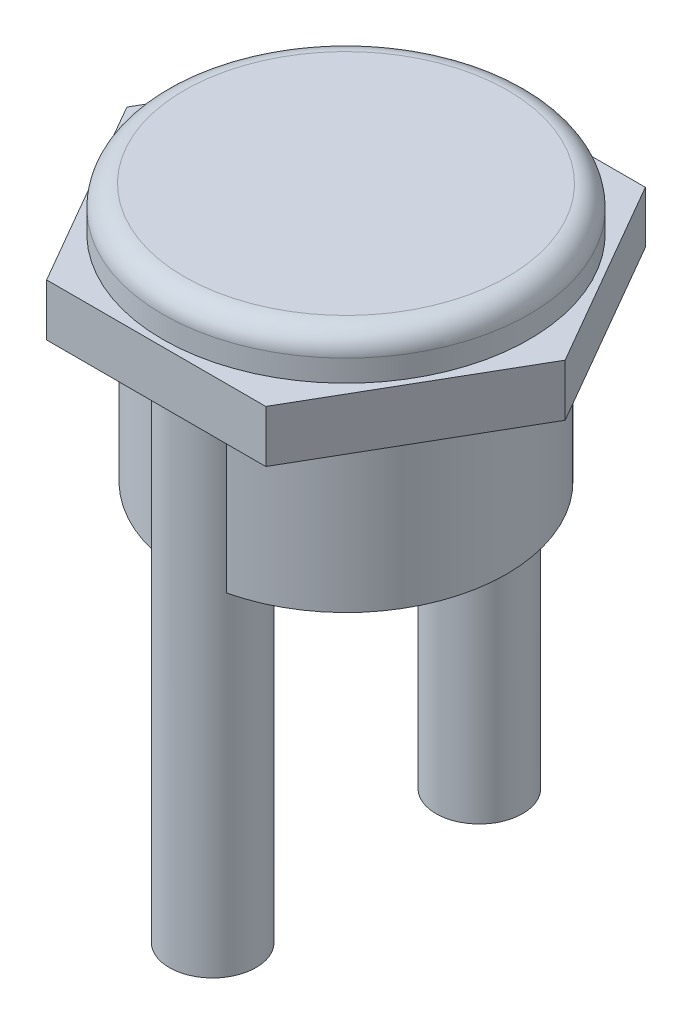
ISO-10303-21;
HEADER;
FILE_DESCRIPTION(('STEP AP214'),'2;1');
FILE_NAME('part.step','',(''),(''),'','','');
FILE_SCHEMA(('AUTOMOTIVE_DESIGN { 1 0 10303 214 1 1 1 1 }'));
ENDSEC;
DATA;
#1=APPLICATION_CONTEXT('core data for automotive mechanical design processes');
#2=APPLICATION_PROTOCOL_DEFINITION('international standard','automotive_design',2000,#1);
#3=PRODUCT_CONTEXT('',#1,'mechanical');
#4=PRODUCT('Part','Part','',(#3));
#5=PRODUCT_RELATED_PRODUCT_CATEGORY('part','',(#4));
#6=PRODUCT_DEFINITION_FORMATION('','',#4);
#7=PRODUCT_DEFINITION_CONTEXT('part definition',#1,'design');
#8=PRODUCT_DEFINITION('design','',#6,#7);
#9=PRODUCT_DEFINITION_SHAPE('','',#8);
#10=(LENGTH_UNIT() NAMED_UNIT(*) SI_UNIT(.MILLI.,.METRE.));
#11=(NAMED_UNIT(*) PLANE_ANGLE_UNIT() SI_UNIT($,.RADIAN.));
#12=(NAMED_UNIT(*) SI_UNIT($,.STERADIAN.) SOLID_ANGLE_UNIT());
#13=UNCERTAINTY_MEASURE_WITH_UNIT(LENGTH_MEASURE(1.E-05),#10,'distance_accuracy_value','');
#14=(GEOMETRIC_REPRESENTATION_CONTEXT(3) GLOBAL_UNCERTAINTY_ASSIGNED_CONTEXT((#13)) GLOBAL_UNIT_ASSIGNED_CONTEXT((#10,
#11,#12)) REPRESENTATION_CONTEXT('',''));
#15=CARTESIAN_POINT('',(0.,0.,0.));
#16=DIRECTION('',(0.,0.,1.));
#17=DIRECTION('',(1.,0.,0.));
#18=AXIS2_PLACEMENT_3D('',#15,#16,#17);
#19=CARTESIAN_POINT('',(0.,-12.573,0.));
#20=DIRECTION('',(0.,1.,0.));
#21=DIRECTION('',(0.,0.,1.));
#22=AXIS2_PLACEMENT_3D('',#19,#20,#21);
#23=CYLINDRICAL_SURFACE('',#22,9.398);
#24=DIRECTION('',(0.,1.,0.));
#25=VECTOR('',#24,1.);
#26=CARTESIAN_POINT('',(-2.15753712528231,-17.548,-9.14699062823553));
#27=LINE('',#26,#25);
#28=CARTESIAN_POINT('',(-2.15753712528231,-12.573,-9.14699062823553));
#29=VERTEX_POINT('',#28);
#30=CARTESIAN_POINT('',(-2.15753712528231,-3.048,-9.14699062823553));
#31=VERTEX_POINT('',#30);
#32=EDGE_CURVE('E116',#29,#31,#27,.T.);
#33=ORIENTED_EDGE('',*,*,#32,.F.);
#34=CARTESIAN_POINT('',(0.,-12.573,0.));
#35=DIRECTION('',(0.,-1.,0.));
#36=DIRECTION('',(0.,0.,-1.));
#37=AXIS2_PLACEMENT_3D('',#34,#35,#36);
#38=CIRCLE('',#37,9.398);
#39=CARTESIAN_POINT('',(-2.15753712528231,-12.573,9.14699062823553));
#40=VERTEX_POINT('',#39);
#41=EDGE_CURVE('E141',#40,#29,#38,.T.);
#42=ORIENTED_EDGE('',*,*,#41,.F.);
#43=DIRECTION('',(0.,1.,0.));
#44=VECTOR('',#43,1.);
#45=CARTESIAN_POINT('',(-2.15753712528231,-17.548,9.14699062823553));
#46=LINE('',#45,#44);
#47=CARTESIAN_POINT('',(-2.15753712528231,-3.048,9.14699062823553));
#48=VERTEX_POINT('',#47);
#49=EDGE_CURVE('E60',#48,#40,#46,.F.);
#50=ORIENTED_EDGE('',*,*,#49,.F.);
#51=CARTESIAN_POINT('',(0.,-3.048,0.));
#52=DIRECTION('',(0.,-1.,0.));
#53=DIRECTION('',(0.,0.,-1.));
#54=AXIS2_PLACEMENT_3D('',#51,#52,#53);
#55=CIRCLE('',#54,9.398);
#56=EDGE_CURVE('E135',#48,#31,#55,.T.);
#57=ORIENTED_EDGE('',*,*,#56,.T.);
#58=EDGE_LOOP('',(#33,#42,#50,#57));
#59=FACE_BOUND('',#58,.T.);
#60=ADVANCED_FACE('F37',(#59),#23,.T.);
#61=DIRECTION('',(0.,1.,0.));
#62=VECTOR('',#61,1.);
#63=CARTESIAN_POINT('',(2.15753712528231,-17.548,-9.14699062823553));
#64=LINE('',#63,#62);
#65=CARTESIAN_POINT('',(2.15753712528231,-3.048,-9.14699062823553));
#66=VERTEX_POINT('',#65);
#67=CARTESIAN_POINT('',(2.15753712528231,-12.573,-9.14699062823553));
#68=VERTEX_POINT('',#67);
#69=EDGE_CURVE('E52',#66,#68,#64,.F.);
#70=ORIENTED_EDGE('',*,*,#69,.F.);
#71=CARTESIAN_POINT('',(2.15753712528231,-3.048,9.14699062823553));
#72=VERTEX_POINT('',#71);
#73=EDGE_CURVE('E127',#66,#72,#55,.T.);
#74=ORIENTED_EDGE('',*,*,#73,.T.);
#75=DIRECTION('',(0.,1.,0.));
#76=VECTOR('',#75,1.);
#77=CARTESIAN_POINT('',(2.15753712528231,-17.548,9.14699062823553));
#78=LINE('',#77,#76);
#79=CARTESIAN_POINT('',(2.15753712528231,-12.573,9.14699062823553));
#80=VERTEX_POINT('',#79);
#81=EDGE_CURVE('E136',#80,#72,#78,.T.);
#82=ORIENTED_EDGE('',*,*,#81,.F.);
#83=EDGE_CURVE('E129',#68,#80,#38,.T.);
#84=ORIENTED_EDGE('',*,*,#83,.F.);
#85=EDGE_LOOP('',(#70,#74,#82,#84));
#86=FACE_BOUND('',#85,.T.);
#87=ADVANCED_FACE('F125',(#86),#23,.T.);
#88=CARTESIAN_POINT('',(0.,2.54,0.));
#89=DIRECTION('',(0.,-1.,0.));
#90=DIRECTION('',(0.,0.,-1.));
#91=AXIS2_PLACEMENT_3D('',#88,#89,#90);
#92=CYLINDRICAL_SURFACE('',#91,10.7315);
#93=CARTESIAN_POINT('',(0.,1.27,0.));
#94=DIRECTION('',(0.,1.,0.));
#95=DIRECTION('',(0.,0.,1.));
#96=AXIS2_PLACEMENT_3D('',#93,#94,#95);
#97=CIRCLE('',#96,10.7315);
#98=CARTESIAN_POINT('',(0.,1.27,10.7315));
#99=VERTEX_POINT('',#98);
#100=EDGE_CURVE('E12',#99,#99,#97,.F.);
#101=ORIENTED_EDGE('',*,*,#100,.T.);
#102=EDGE_LOOP('',(#101));
#103=FACE_BOUND('',#102,.T.);
#104=CARTESIAN_POINT('',(0.,0.,0.));
#105=DIRECTION('',(0.,-1.,0.));
#106=DIRECTION('',(0.,0.,-1.));
#107=AXIS2_PLACEMENT_3D('',#104,#105,#106);
#108=CIRCLE('',#107,10.7315);
#109=CARTESIAN_POINT('',(0.,0.,-10.7315));
#110=VERTEX_POINT('',#109);
#111=EDGE_CURVE('E186',#110,#110,#108,.T.);
#112=ORIENTED_EDGE('',*,*,#111,.F.);
#113=EDGE_LOOP('',(#112));
#114=FACE_BOUND('',#113,.T.);
#115=ADVANCED_FACE('F212',(#103,#114),#92,.T.);
#116=CARTESIAN_POINT('',(0.,2.54,0.));
#117=DIRECTION('',(0.,1.,0.));
#118=DIRECTION('',(0.,0.,1.));
#119=AXIS2_PLACEMENT_3D('',#116,#117,#118);
#120=PLANE('',#119);
#121=CARTESIAN_POINT('',(0.,2.54,0.));
#122=DIRECTION('',(0.,1.,0.));
#123=DIRECTION('',(0.,0.,1.));
#124=AXIS2_PLACEMENT_3D('',#121,#122,#123);
#125=CIRCLE('',#124,9.4615);
#126=CARTESIAN_POINT('',(0.,2.54,9.4615));
#127=VERTEX_POINT('',#126);
#128=EDGE_CURVE('E45',#127,#127,#125,.T.);
#129=ORIENTED_EDGE('',*,*,#128,.T.);
#130=EDGE_LOOP('',(#129));
#131=FACE_BOUND('',#130,.T.);
#132=ADVANCED_FACE('F195',(#131),#120,.T.);
#133=CARTESIAN_POINT('',(-6.41580486636972,-3.048,11.1125));
#134=DIRECTION('',(0.866025403784438,0.,-0.5));
#135=DIRECTION('',(-0.5,0.,-0.866025403784439));
#136=AXIS2_PLACEMENT_3D('',#133,#134,#135);
#137=PLANE('',#136);
#138=DIRECTION('',(-0.5,0.,-0.866025403784438));
#139=VECTOR('',#138,1.);
#140=CARTESIAN_POINT('',(-6.41580486636972,0.,11.1125));
#141=LINE('',#140,#139);
#142=CARTESIAN_POINT('',(-6.41580486636972,0.,11.1125));
#143=VERTEX_POINT('',#142);
#144=CARTESIAN_POINT('',(-12.8316097327394,0.,0.));
#145=VERTEX_POINT('',#144);
#146=EDGE_CURVE('E157',#143,#145,#141,.T.);
#147=ORIENTED_EDGE('',*,*,#146,.T.);
#148=DIRECTION('',(0.,1.,0.));
#149=VECTOR('',#148,1.);
#150=CARTESIAN_POINT('',(-12.8316097327394,-3.048,0.));
#151=LINE('',#150,#149);
#152=CARTESIAN_POINT('',(-12.8316097327394,-3.048,0.));
#153=VERTEX_POINT('',#152);
#154=EDGE_CURVE('E183',#153,#145,#151,.T.);
#155=ORIENTED_EDGE('',*,*,#154,.F.);
#156=DIRECTION('',(-0.5,0.,-0.866025403784438));
#157=VECTOR('',#156,1.);
#158=CARTESIAN_POINT('',(-6.41580486636972,-3.048,11.1125));
#159=LINE('',#158,#157);
#160=CARTESIAN_POINT('',(-6.41580486636972,-3.048,11.1125));
#161=VERTEX_POINT('',#160);
#162=EDGE_CURVE('E142',#161,#153,#159,.T.);
#163=ORIENTED_EDGE('',*,*,#162,.F.);
#164=DIRECTION('',(0.,1.,0.));
#165=VECTOR('',#164,1.);
#166=CARTESIAN_POINT('',(-6.41580486636972,-3.048,11.1125));
#167=LINE('',#166,#165);
#168=EDGE_CURVE('E156',#161,#143,#167,.T.);
#169=ORIENTED_EDGE('',*,*,#168,.T.);
#170=EDGE_LOOP('',(#147,#155,#163,#169));
#171=FACE_BOUND('',#170,.T.);
#172=ADVANCED_FACE('F242',(#171),#137,.F.);
#173=CARTESIAN_POINT('',(-12.8316097327394,-3.048,0.));
#174=DIRECTION('',(0.866025403784439,0.,0.5));
#175=DIRECTION('',(0.5,0.,-0.866025403784439));
#176=AXIS2_PLACEMENT_3D('',#173,#174,#175);
#177=PLANE('',#176);
#178=DIRECTION('',(0.5,0.,-0.866025403784439));
#179=VECTOR('',#178,1.);
#180=CARTESIAN_POINT('',(-12.8316097327394,0.,0.));
#181=LINE('',#180,#179);
#182=CARTESIAN_POINT('',(-6.41580486636972,0.,-11.1125));
#183=VERTEX_POINT('',#182);
#184=EDGE_CURVE('E160',#145,#183,#181,.T.);
#185=ORIENTED_EDGE('',*,*,#184,.T.);
#186=DIRECTION('',(0.,1.,0.));
#187=VECTOR('',#186,1.);
#188=CARTESIAN_POINT('',(-6.41580486636972,-3.048,-11.1125));
#189=LINE('',#188,#187);
#190=CARTESIAN_POINT('',(-6.41580486636972,-3.048,-11.1125));
#191=VERTEX_POINT('',#190);
#192=EDGE_CURVE('E180',#191,#183,#189,.T.);
#193=ORIENTED_EDGE('',*,*,#192,.F.);
#194=DIRECTION('',(0.5,0.,-0.866025403784439));
#195=VECTOR('',#194,1.);
#196=CARTESIAN_POINT('',(-12.8316097327394,-3.048,0.));
#197=LINE('',#196,#195);
#198=EDGE_CURVE('E145',#153,#191,#197,.T.);
#199=ORIENTED_EDGE('',*,*,#198,.F.);
#200=ORIENTED_EDGE('',*,*,#154,.T.);
#201=EDGE_LOOP('',(#185,#193,#199,#200));
#202=FACE_BOUND('',#201,.T.);
#203=ADVANCED_FACE('F238',(#202),#177,.F.);
#204=CARTESIAN_POINT('',(-6.41580486636972,-3.048,-11.1125));
#205=DIRECTION('',(0.,0.,1.));
#206=DIRECTION('',(1.,0.,0.));
#207=AXIS2_PLACEMENT_3D('',#204,#205,#206);
#208=PLANE('',#207);
#209=DIRECTION('',(1.,0.,0.));
#210=VECTOR('',#209,1.);
#211=CARTESIAN_POINT('',(-6.41580486636972,0.,-11.1125));
#212=LINE('',#211,#210);
#213=CARTESIAN_POINT('',(6.41580486636971,0.,-11.1125));
#214=VERTEX_POINT('',#213);
#215=EDGE_CURVE('E162',#183,#214,#212,.T.);
#216=ORIENTED_EDGE('',*,*,#215,.T.);
#217=DIRECTION('',(0.,1.,0.));
#218=VECTOR('',#217,1.);
#219=CARTESIAN_POINT('',(6.41580486636971,-3.048,-11.1125));
#220=LINE('',#219,#218);
#221=CARTESIAN_POINT('',(6.41580486636971,-3.048,-11.1125));
#222=VERTEX_POINT('',#221);
#223=EDGE_CURVE('E177',#222,#214,#220,.T.);
#224=ORIENTED_EDGE('',*,*,#223,.F.);
#225=DIRECTION('',(1.,0.,0.));
#226=VECTOR('',#225,1.);
#227=CARTESIAN_POINT('',(-6.41580486636972,-3.048,-11.1125));
#228=LINE('',#227,#226);
#229=EDGE_CURVE('E148',#191,#222,#228,.T.);
#230=ORIENTED_EDGE('',*,*,#229,.F.);
#231=ORIENTED_EDGE('',*,*,#192,.T.);
#232=EDGE_LOOP('',(#216,#224,#230,#231));
#233=FACE_BOUND('',#232,.T.);
#234=ADVANCED_FACE('F234',(#233),#208,.F.);
#235=CARTESIAN_POINT('',(6.41580486636971,-3.048,-11.1125));
#236=DIRECTION('',(-0.866025403784439,0.,0.5));
#237=DIRECTION('',(0.5,0.,0.866025403784439));
#238=AXIS2_PLACEMENT_3D('',#235,#236,#237);
#239=PLANE('',#238);
#240=DIRECTION('',(0.5,0.,0.866025403784439));
#241=VECTOR('',#240,1.);
#242=CARTESIAN_POINT('',(6.41580486636971,0.,-11.1125));
#243=LINE('',#242,#241);
#244=CARTESIAN_POINT('',(12.8316097327394,0.,0.));
#245=VERTEX_POINT('',#244);
#246=EDGE_CURVE('E164',#214,#245,#243,.T.);
#247=ORIENTED_EDGE('',*,*,#246,.T.);
#248=DIRECTION('',(0.,1.,0.));
#249=VECTOR('',#248,1.);
#250=CARTESIAN_POINT('',(12.8316097327394,-3.048,0.));
#251=LINE('',#250,#249);
#252=CARTESIAN_POINT('',(12.8316097327394,-3.048,0.));
#253=VERTEX_POINT('',#252);
#254=EDGE_CURVE('E174',#253,#245,#251,.T.);
#255=ORIENTED_EDGE('',*,*,#254,.F.);
#256=DIRECTION('',(0.5,0.,0.866025403784439));
#257=VECTOR('',#256,1.);
#258=CARTESIAN_POINT('',(6.41580486636971,-3.048,-11.1125));
#259=LINE('',#258,#257);
#260=EDGE_CURVE('E150',#222,#253,#259,.T.);
#261=ORIENTED_EDGE('',*,*,#260,.F.);
#262=ORIENTED_EDGE('',*,*,#223,.T.);
#263=EDGE_LOOP('',(#247,#255,#261,#262));
#264=FACE_BOUND('',#263,.T.);
#265=ADVANCED_FACE('F230',(#264),#239,.F.);
#266=CARTESIAN_POINT('',(12.8316097327394,-3.048,0.));
#267=DIRECTION('',(-0.866025403784439,0.,-0.5));
#268=DIRECTION('',(-0.5,0.,0.866025403784439));
#269=AXIS2_PLACEMENT_3D('',#266,#267,#268);
#270=PLANE('',#269);
#271=DIRECTION('',(-0.5,0.,0.866025403784439));
#272=VECTOR('',#271,1.);
#273=CARTESIAN_POINT('',(12.8316097327394,0.,0.));
#274=LINE('',#273,#272);
#275=CARTESIAN_POINT('',(6.41580486636972,0.,11.1125));
#276=VERTEX_POINT('',#275);
#277=EDGE_CURVE('E166',#245,#276,#274,.T.);
#278=ORIENTED_EDGE('',*,*,#277,.T.);
#279=DIRECTION('',(0.,1.,0.));
#280=VECTOR('',#279,1.);
#281=CARTESIAN_POINT('',(6.41580486636972,-3.048,11.1125));
#282=LINE('',#281,#280);
#283=CARTESIAN_POINT('',(6.41580486636972,-3.048,11.1125));
#284=VERTEX_POINT('',#283);
#285=EDGE_CURVE('E171',#284,#276,#282,.T.);
#286=ORIENTED_EDGE('',*,*,#285,.F.);
#287=DIRECTION('',(-0.5,0.,0.866025403784439));
#288=VECTOR('',#287,1.);
#289=CARTESIAN_POINT('',(12.8316097327394,-3.048,0.));
#290=LINE('',#289,#288);
#291=EDGE_CURVE('E152',#253,#284,#290,.T.);
#292=ORIENTED_EDGE('',*,*,#291,.F.);
#293=ORIENTED_EDGE('',*,*,#254,.T.);
#294=EDGE_LOOP('',(#278,#286,#292,#293));
#295=FACE_BOUND('',#294,.T.);
#296=ADVANCED_FACE('F226',(#295),#270,.F.);
#297=CARTESIAN_POINT('',(6.41580486636972,-3.048,11.1125));
#298=DIRECTION('',(0.,0.,-1.));
#299=DIRECTION('',(-1.,0.,0.));
#300=AXIS2_PLACEMENT_3D('',#297,#298,#299);
#301=PLANE('',#300);
#302=DIRECTION('',(-1.,0.,0.));
#303=VECTOR('',#302,1.);
#304=CARTESIAN_POINT('',(6.41580486636972,0.,11.1125));
#305=LINE('',#304,#303);
#306=EDGE_CURVE('E146',#276,#143,#305,.T.);
#307=ORIENTED_EDGE('',*,*,#306,.T.);
#308=ORIENTED_EDGE('',*,*,#168,.F.);
#309=DIRECTION('',(-1.,0.,0.));
#310=VECTOR('',#309,1.);
#311=CARTESIAN_POINT('',(6.41580486636972,-3.048,11.1125));
#312=LINE('',#311,#310);
#313=EDGE_CURVE('E154',#284,#161,#312,.T.);
#314=ORIENTED_EDGE('',*,*,#313,.F.);
#315=ORIENTED_EDGE('',*,*,#285,.T.);
#316=EDGE_LOOP('',(#307,#308,#314,#315));
#317=FACE_BOUND('',#316,.T.);
#318=ADVANCED_FACE('F220',(#317),#301,.F.);
#319=CARTESIAN_POINT('',(0.,-3.048,0.));
#320=DIRECTION('',(0.,-1.,0.));
#321=DIRECTION('',(0.,0.,-1.));
#322=AXIS2_PLACEMENT_3D('',#319,#320,#321);
#323=PLANE('',#322);
#324=ORIENTED_EDGE('',*,*,#73,.F.);
#325=CARTESIAN_POINT('',(0.,-3.048,-7.80660502960036));
#326=DIRECTION('',(0.,-1.,0.));
#327=DIRECTION('',(0.,0.,-1.));
#328=AXIS2_PLACEMENT_3D('',#325,#326,#327);
#329=CIRCLE('',#328,2.54);
#330=EDGE_CURVE('E113',#31,#66,#329,.T.);
#331=ORIENTED_EDGE('',*,*,#330,.F.);
#332=ORIENTED_EDGE('',*,*,#56,.F.);
#333=CARTESIAN_POINT('',(0.,-3.048,7.80660502960036));
#334=DIRECTION('',(0.,-1.,0.));
#335=DIRECTION('',(0.,0.,-1.));
#336=AXIS2_PLACEMENT_3D('',#333,#334,#335);
#337=CIRCLE('',#336,2.54);
#338=EDGE_CURVE('E134',#72,#48,#337,.T.);
#339=ORIENTED_EDGE('',*,*,#338,.F.);
#340=EDGE_LOOP('',(#324,#331,#332,#339));
#341=FACE_BOUND('',#340,.T.);
#342=ORIENTED_EDGE('',*,*,#162,.T.);
#343=ORIENTED_EDGE('',*,*,#198,.T.);
#344=ORIENTED_EDGE('',*,*,#229,.T.);
#345=ORIENTED_EDGE('',*,*,#260,.T.);
#346=ORIENTED_EDGE('',*,*,#291,.T.);
#347=ORIENTED_EDGE('',*,*,#313,.T.);
#348=EDGE_LOOP('',(#342,#343,#344,#345,#346,#347));
#349=FACE_BOUND('',#348,.T.);
#350=ADVANCED_FACE('F132',(#341,#349),#323,.T.);
#351=CARTESIAN_POINT('',(0.,0.,0.));
#352=DIRECTION('',(0.,-1.,0.));
#353=DIRECTION('',(0.,0.,-1.));
#354=AXIS2_PLACEMENT_3D('',#351,#352,#353);
#355=PLANE('',#354);
#356=ORIENTED_EDGE('',*,*,#111,.T.);
#357=EDGE_LOOP('',(#356));
#358=FACE_BOUND('',#357,.T.);
#359=ORIENTED_EDGE('',*,*,#146,.F.);
#360=ORIENTED_EDGE('',*,*,#306,.F.);
#361=ORIENTED_EDGE('',*,*,#277,.F.);
#362=ORIENTED_EDGE('',*,*,#246,.F.);
#363=ORIENTED_EDGE('',*,*,#215,.F.);
#364=ORIENTED_EDGE('',*,*,#184,.F.);
#365=EDGE_LOOP('',(#359,#360,#361,#362,#363,#364));
#366=FACE_BOUND('',#365,.T.);
#367=ADVANCED_FACE('F219',(#358,#366),#355,.F.);
#368=CARTESIAN_POINT('',(0.,-12.573,0.));
#369=DIRECTION('',(0.,-1.,0.));
#370=DIRECTION('',(0.,0.,-1.));
#371=AXIS2_PLACEMENT_3D('',#368,#369,#370);
#372=PLANE('',#371);
#373=ORIENTED_EDGE('',*,*,#41,.T.);
#374=CARTESIAN_POINT('',(0.,-12.573,-7.80660502960036));
#375=DIRECTION('',(0.,-1.,0.));
#376=DIRECTION('',(0.,0.,-1.));
#377=AXIS2_PLACEMENT_3D('',#374,#375,#376);
#378=CIRCLE('',#377,2.54);
#379=EDGE_CURVE('E191',#29,#68,#378,.F.);
#380=ORIENTED_EDGE('',*,*,#379,.T.);
#381=ORIENTED_EDGE('',*,*,#83,.T.);
#382=CARTESIAN_POINT('',(0.,-12.573,7.80660502960036));
#383=DIRECTION('',(0.,-1.,0.));
#384=DIRECTION('',(0.,0.,-1.));
#385=AXIS2_PLACEMENT_3D('',#382,#383,#384);
#386=CIRCLE('',#385,2.54);
#387=EDGE_CURVE('E189',#80,#40,#386,.F.);
#388=ORIENTED_EDGE('',*,*,#387,.T.);
#389=EDGE_LOOP('',(#373,#380,#381,#388));
#390=FACE_BOUND('',#389,.T.);
#391=ADVANCED_FACE('F215',(#390),#372,.T.);
#392=CARTESIAN_POINT('',(0.,-32.048,7.80660502960036));
#393=DIRECTION('',(0.,1.,0.));
#394=DIRECTION('',(0.,0.,1.));
#395=AXIS2_PLACEMENT_3D('',#392,#393,#394);
#396=CYLINDRICAL_SURFACE('',#395,2.54);
#397=CARTESIAN_POINT('',(0.,-32.048,7.80660502960036));
#398=DIRECTION('',(0.,-1.,0.));
#399=DIRECTION('',(0.,0.,-1.));
#400=AXIS2_PLACEMENT_3D('',#397,#398,#399);
#401=CIRCLE('',#400,2.54);
#402=CARTESIAN_POINT('',(0.,-32.048,5.26660502960036));
#403=VERTEX_POINT('',#402);
#404=EDGE_CURVE('E420',#403,#403,#401,.T.);
#405=ORIENTED_EDGE('',*,*,#404,.F.);
#406=EDGE_LOOP('',(#405));
#407=FACE_BOUND('',#406,.T.);
#408=ORIENTED_EDGE('',*,*,#387,.F.);
#409=ORIENTED_EDGE('',*,*,#81,.T.);
#410=ORIENTED_EDGE('',*,*,#338,.T.);
#411=ORIENTED_EDGE('',*,*,#49,.T.);
#412=EDGE_LOOP('',(#408,#409,#410,#411));
#413=FACE_BOUND('',#412,.T.);
#414=ADVANCED_FACE('F317',(#407,#413),#396,.T.);
#415=CARTESIAN_POINT('',(0.,-32.048,7.80660502960036));
#416=DIRECTION('',(0.,-1.,0.));
#417=DIRECTION('',(0.,0.,-1.));
#418=AXIS2_PLACEMENT_3D('',#415,#416,#417);
#419=PLANE('',#418);
#420=ORIENTED_EDGE('',*,*,#404,.T.);
#421=EDGE_LOOP('',(#420));
#422=FACE_BOUND('',#421,.T.);
#423=ADVANCED_FACE('F324',(#422),#419,.T.);
#424=CARTESIAN_POINT('',(0.,-32.048,-7.80660502960036));
#425=DIRECTION('',(0.,1.,0.));
#426=DIRECTION('',(0.,0.,1.));
#427=AXIS2_PLACEMENT_3D('',#424,#425,#426);
#428=CYLINDRICAL_SURFACE('',#427,2.54);
#429=CARTESIAN_POINT('',(0.,-32.048,-7.80660502960036));
#430=DIRECTION('',(0.,-1.,0.));
#431=DIRECTION('',(0.,0.,-1.));
#432=AXIS2_PLACEMENT_3D('',#429,#430,#431);
#433=CIRCLE('',#432,2.54);
#434=CARTESIAN_POINT('',(0.,-32.048,-10.3466050296004));
#435=VERTEX_POINT('',#434);
#436=EDGE_CURVE('E121',#435,#435,#433,.T.);
#437=ORIENTED_EDGE('',*,*,#436,.F.);
#438=EDGE_LOOP('',(#437));
#439=FACE_BOUND('',#438,.T.);
#440=ORIENTED_EDGE('',*,*,#379,.F.);
#441=ORIENTED_EDGE('',*,*,#32,.T.);
#442=ORIENTED_EDGE('',*,*,#330,.T.);
#443=ORIENTED_EDGE('',*,*,#69,.T.);
#444=EDGE_LOOP('',(#440,#441,#442,#443));
#445=FACE_BOUND('',#444,.T.);
#446=ADVANCED_FACE('F114',(#439,#445),#428,.T.);
#447=CARTESIAN_POINT('',(0.,-32.048,-7.80660502960036));
#448=DIRECTION('',(0.,-1.,0.));
#449=DIRECTION('',(0.,0.,-1.));
#450=AXIS2_PLACEMENT_3D('',#447,#448,#449);
#451=PLANE('',#450);
#452=ORIENTED_EDGE('',*,*,#436,.T.);
#453=EDGE_LOOP('',(#452));
#454=FACE_BOUND('',#453,.T.);
#455=ADVANCED_FACE('F198',(#454),#451,.T.);
#456=CARTESIAN_POINT('',(0.,1.27,0.));
#457=DIRECTION('',(0.,1.,0.));
#458=DIRECTION('',(0.,0.,1.));
#459=AXIS2_PLACEMENT_3D('',#456,#457,#458);
#460=TOROIDAL_SURFACE('',#459,9.4615,1.27);
#461=ORIENTED_EDGE('',*,*,#100,.F.);
#462=EDGE_LOOP('',(#461));
#463=FACE_BOUND('',#462,.T.);
#464=ORIENTED_EDGE('',*,*,#128,.F.);
#465=EDGE_LOOP('',(#464));
#466=FACE_BOUND('',#465,.T.);
#467=ADVANCED_FACE('F39',(#463,#466),#460,.T.);
#468=CLOSED_SHELL('',(#60,#87,#115,#132,#172,#203,#234,#265,#296,#318,#350,#367,#391,#414,#423,
#446,#455,#467));
#469=MANIFOLD_SOLID_BREP('B2',#468);
#470=ADVANCED_BREP_SHAPE_REPRESENTATION('',(#18,#469),#14);
#471=SHAPE_DEFINITION_REPRESENTATION(#9,#470);
ENDSEC;
END-ISO-10303-21;
